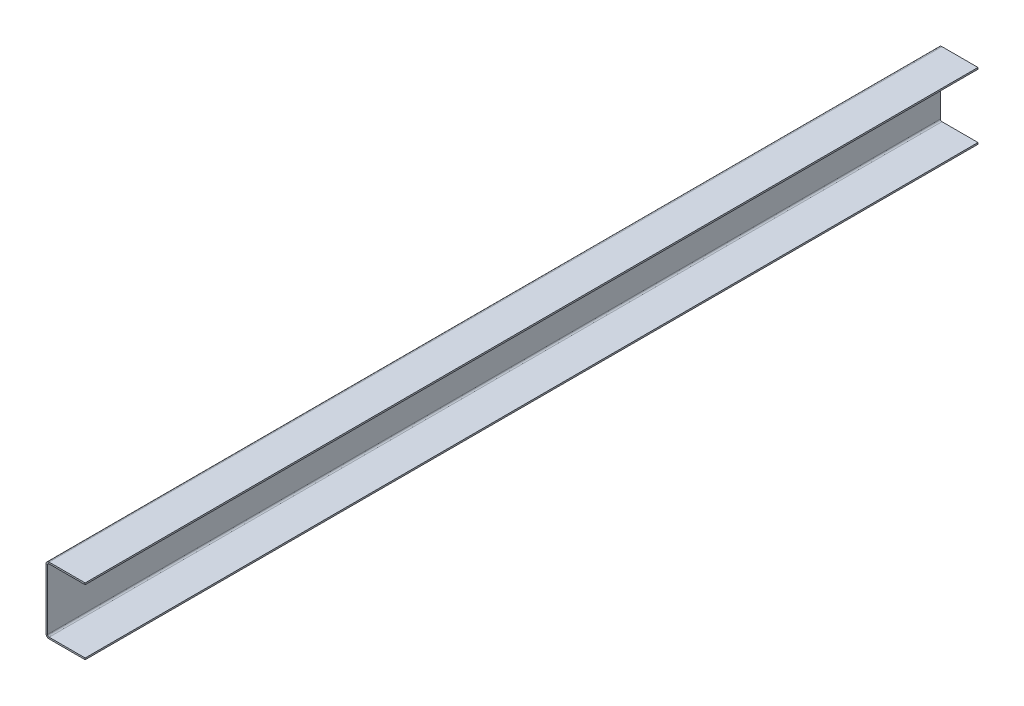
ISO-10303-21;
HEADER;
FILE_DESCRIPTION(('STEP AP214'),'2;1');
FILE_NAME('part.step','',(''),(''),'','','');
FILE_SCHEMA(('AUTOMOTIVE_DESIGN { 1 0 10303 214 1 1 1 1 }'));
ENDSEC;
DATA;
#1=APPLICATION_CONTEXT('core data for automotive mechanical design processes');
#2=APPLICATION_PROTOCOL_DEFINITION('international standard','automotive_design',2000,#1);
#3=PRODUCT_CONTEXT('',#1,'mechanical');
#4=PRODUCT('Part','Part','',(#3));
#5=PRODUCT_RELATED_PRODUCT_CATEGORY('part','',(#4));
#6=PRODUCT_DEFINITION_FORMATION('','',#4);
#7=PRODUCT_DEFINITION_CONTEXT('part definition',#1,'design');
#8=PRODUCT_DEFINITION('design','',#6,#7);
#9=PRODUCT_DEFINITION_SHAPE('','',#8);
#10=(LENGTH_UNIT() NAMED_UNIT(*) SI_UNIT(.MILLI.,.METRE.));
#11=(NAMED_UNIT(*) PLANE_ANGLE_UNIT() SI_UNIT($,.RADIAN.));
#12=(NAMED_UNIT(*) SI_UNIT($,.STERADIAN.) SOLID_ANGLE_UNIT());
#13=UNCERTAINTY_MEASURE_WITH_UNIT(LENGTH_MEASURE(1.E-05),#10,'distance_accuracy_value','');
#14=(GEOMETRIC_REPRESENTATION_CONTEXT(3) GLOBAL_UNCERTAINTY_ASSIGNED_CONTEXT((#13)) GLOBAL_UNIT_ASSIGNED_CONTEXT((#10,
#11,#12)) REPRESENTATION_CONTEXT('',''));
#15=CARTESIAN_POINT('',(0.,0.,0.));
#16=DIRECTION('',(0.,0.,1.));
#17=DIRECTION('',(1.,0.,0.));
#18=AXIS2_PLACEMENT_3D('',#15,#16,#17);
#19=CARTESIAN_POINT('',(4.,85.,1140.));
#20=DIRECTION('',(0.,0.,1.));
#21=DIRECTION('',(1.,0.,0.));
#22=AXIS2_PLACEMENT_3D('',#19,#20,#21);
#23=PLANE('',#22);
#24=DIRECTION('',(0.,-1.,0.));
#25=VECTOR('',#24,1.);
#26=CARTESIAN_POINT('',(4.,85.,1140.));
#27=LINE('',#26,#25);
#28=CARTESIAN_POINT('',(4.,85.,1140.));
#29=VERTEX_POINT('',#28);
#30=CARTESIAN_POINT('',(4.,83.,1140.));
#31=VERTEX_POINT('',#30);
#32=EDGE_CURVE('E11',#29,#31,#27,.T.);
#33=ORIENTED_EDGE('',*,*,#32,.F.);
#34=CARTESIAN_POINT('',(4.,81.,1140.));
#35=DIRECTION('',(0.,0.,-1.));
#36=DIRECTION('',(-1.,0.,0.));
#37=AXIS2_PLACEMENT_3D('',#34,#35,#36);
#38=CIRCLE('',#37,4.);
#39=CARTESIAN_POINT('',(0.,81.,1140.));
#40=VERTEX_POINT('',#39);
#41=EDGE_CURVE('E146',#29,#40,#38,.F.);
#42=ORIENTED_EDGE('',*,*,#41,.T.);
#43=DIRECTION('',(-1.,0.,0.));
#44=VECTOR('',#43,1.);
#45=CARTESIAN_POINT('',(2.,81.,1140.));
#46=LINE('',#45,#44);
#47=CARTESIAN_POINT('',(2.,81.,1140.));
#48=VERTEX_POINT('',#47);
#49=EDGE_CURVE('E44',#48,#40,#46,.T.);
#50=ORIENTED_EDGE('',*,*,#49,.F.);
#51=CARTESIAN_POINT('',(4.,81.,1140.));
#52=DIRECTION('',(0.,0.,1.));
#53=DIRECTION('',(1.,0.,0.));
#54=AXIS2_PLACEMENT_3D('',#51,#52,#53);
#55=CIRCLE('',#54,2.);
#56=EDGE_CURVE('E240',#31,#48,#55,.T.);
#57=ORIENTED_EDGE('',*,*,#56,.F.);
#58=EDGE_LOOP('',(#33,#42,#50,#57));
#59=FACE_BOUND('',#58,.T.);
#60=ADVANCED_FACE('F36',(#59),#23,.T.);
#61=CARTESIAN_POINT('',(2.,81.,1140.));
#62=DIRECTION('',(0.,0.,1.));
#63=DIRECTION('',(1.,0.,0.));
#64=AXIS2_PLACEMENT_3D('',#61,#62,#63);
#65=PLANE('',#64);
#66=DIRECTION('',(-1.,0.,0.));
#67=VECTOR('',#66,1.);
#68=CARTESIAN_POINT('',(50.,85.,1140.));
#69=LINE('',#68,#67);
#70=CARTESIAN_POINT('',(50.,85.,1140.));
#71=VERTEX_POINT('',#70);
#72=EDGE_CURVE('E151',#71,#29,#69,.T.);
#73=ORIENTED_EDGE('',*,*,#72,.T.);
#74=ORIENTED_EDGE('',*,*,#32,.T.);
#75=DIRECTION('',(1.,0.,0.));
#76=VECTOR('',#75,1.);
#77=CARTESIAN_POINT('',(50.,83.,1140.));
#78=LINE('',#77,#76);
#79=CARTESIAN_POINT('',(50.,83.,1140.));
#80=VERTEX_POINT('',#79);
#81=EDGE_CURVE('E253',#80,#31,#78,.F.);
#82=ORIENTED_EDGE('',*,*,#81,.F.);
#83=DIRECTION('',(0.,-1.,0.));
#84=VECTOR('',#83,1.);
#85=CARTESIAN_POINT('',(50.,85.,1140.));
#86=LINE('',#85,#84);
#87=EDGE_CURVE('E255',#71,#80,#86,.T.);
#88=ORIENTED_EDGE('',*,*,#87,.F.);
#89=EDGE_LOOP('',(#73,#74,#82,#88));
#90=FACE_BOUND('',#89,.T.);
#91=ADVANCED_FACE('F266',(#90),#65,.T.);
#92=CARTESIAN_POINT('',(0.,81.,0.));
#93=DIRECTION('',(0.,0.,-1.));
#94=DIRECTION('',(-1.,0.,0.));
#95=AXIS2_PLACEMENT_3D('',#92,#93,#94);
#96=PLANE('',#95);
#97=DIRECTION('',(1.,0.,0.));
#98=VECTOR('',#97,1.);
#99=CARTESIAN_POINT('',(0.,81.,0.));
#100=LINE('',#99,#98);
#101=CARTESIAN_POINT('',(0.,81.,0.));
#102=VERTEX_POINT('',#101);
#103=CARTESIAN_POINT('',(2.,81.,0.));
#104=VERTEX_POINT('',#103);
#105=EDGE_CURVE('E144',#102,#104,#100,.T.);
#106=ORIENTED_EDGE('',*,*,#105,.F.);
#107=CARTESIAN_POINT('',(4.,81.,0.));
#108=DIRECTION('',(0.,0.,-1.));
#109=DIRECTION('',(-1.,0.,0.));
#110=AXIS2_PLACEMENT_3D('',#107,#108,#109);
#111=CIRCLE('',#110,4.);
#112=CARTESIAN_POINT('',(4.,85.,0.));
#113=VERTEX_POINT('',#112);
#114=EDGE_CURVE('E158',#113,#102,#111,.F.);
#115=ORIENTED_EDGE('',*,*,#114,.F.);
#116=DIRECTION('',(0.,1.,0.));
#117=VECTOR('',#116,1.);
#118=CARTESIAN_POINT('',(4.,83.,0.));
#119=LINE('',#118,#117);
#120=CARTESIAN_POINT('',(4.,83.,0.));
#121=VERTEX_POINT('',#120);
#122=EDGE_CURVE('E231',#121,#113,#119,.T.);
#123=ORIENTED_EDGE('',*,*,#122,.F.);
#124=CARTESIAN_POINT('',(4.,81.,0.));
#125=DIRECTION('',(0.,0.,1.));
#126=DIRECTION('',(1.,0.,0.));
#127=AXIS2_PLACEMENT_3D('',#124,#125,#126);
#128=CIRCLE('',#127,2.);
#129=EDGE_CURVE('E185',#121,#104,#128,.T.);
#130=ORIENTED_EDGE('',*,*,#129,.T.);
#131=EDGE_LOOP('',(#106,#115,#123,#130));
#132=FACE_BOUND('',#131,.T.);
#133=ADVANCED_FACE('F245',(#132),#96,.T.);
#134=CARTESIAN_POINT('',(4.,83.,0.));
#135=DIRECTION('',(0.,0.,-1.));
#136=DIRECTION('',(-1.,0.,0.));
#137=AXIS2_PLACEMENT_3D('',#134,#135,#136);
#138=PLANE('',#137);
#139=DIRECTION('',(0.,-1.,0.));
#140=VECTOR('',#139,1.);
#141=CARTESIAN_POINT('',(0.,85.,0.));
#142=LINE('',#141,#140);
#143=CARTESIAN_POINT('',(0.,4.,0.));
#144=VERTEX_POINT('',#143);
#145=EDGE_CURVE('E198',#102,#144,#142,.T.);
#146=ORIENTED_EDGE('',*,*,#145,.F.);
#147=ORIENTED_EDGE('',*,*,#105,.T.);
#148=DIRECTION('',(0.,1.,0.));
#149=VECTOR('',#148,1.);
#150=CARTESIAN_POINT('',(2.,85.,0.));
#151=LINE('',#150,#149);
#152=CARTESIAN_POINT('',(2.,4.,0.));
#153=VERTEX_POINT('',#152);
#154=EDGE_CURVE('E183',#104,#153,#151,.F.);
#155=ORIENTED_EDGE('',*,*,#154,.T.);
#156=DIRECTION('',(-1.,0.,0.));
#157=VECTOR('',#156,1.);
#158=CARTESIAN_POINT('',(2.,4.,0.));
#159=LINE('',#158,#157);
#160=EDGE_CURVE('E93',#153,#144,#159,.T.);
#161=ORIENTED_EDGE('',*,*,#160,.T.);
#162=EDGE_LOOP('',(#146,#147,#155,#161));
#163=FACE_BOUND('',#162,.T.);
#164=ADVANCED_FACE('F233',(#163),#138,.T.);
#165=CARTESIAN_POINT('',(0.,4.,1140.));
#166=DIRECTION('',(0.,0.,1.));
#167=DIRECTION('',(1.,0.,0.));
#168=AXIS2_PLACEMENT_3D('',#165,#166,#167);
#169=PLANE('',#168);
#170=DIRECTION('',(1.,0.,0.));
#171=VECTOR('',#170,1.);
#172=CARTESIAN_POINT('',(0.,4.,1140.));
#173=LINE('',#172,#171);
#174=CARTESIAN_POINT('',(0.,4.,1140.));
#175=VERTEX_POINT('',#174);
#176=CARTESIAN_POINT('',(2.,4.,1140.));
#177=VERTEX_POINT('',#176);
#178=EDGE_CURVE('E229',#175,#177,#173,.T.);
#179=ORIENTED_EDGE('',*,*,#178,.F.);
#180=CARTESIAN_POINT('',(4.,4.,1140.));
#181=DIRECTION('',(0.,0.,-1.));
#182=DIRECTION('',(-1.,0.,0.));
#183=AXIS2_PLACEMENT_3D('',#180,#181,#182);
#184=CIRCLE('',#183,4.);
#185=CARTESIAN_POINT('',(4.,0.,1140.));
#186=VERTEX_POINT('',#185);
#187=EDGE_CURVE('E166',#175,#186,#184,.F.);
#188=ORIENTED_EDGE('',*,*,#187,.T.);
#189=DIRECTION('',(0.,-1.,0.));
#190=VECTOR('',#189,1.);
#191=CARTESIAN_POINT('',(4.,2.,1140.));
#192=LINE('',#191,#190);
#193=CARTESIAN_POINT('',(4.,2.,1140.));
#194=VERTEX_POINT('',#193);
#195=EDGE_CURVE('E52',#194,#186,#192,.T.);
#196=ORIENTED_EDGE('',*,*,#195,.F.);
#197=CARTESIAN_POINT('',(4.,4.,1140.));
#198=DIRECTION('',(0.,0.,1.));
#199=DIRECTION('',(1.,0.,0.));
#200=AXIS2_PLACEMENT_3D('',#197,#198,#199);
#201=CIRCLE('',#200,2.);
#202=EDGE_CURVE('E257',#177,#194,#201,.T.);
#203=ORIENTED_EDGE('',*,*,#202,.F.);
#204=EDGE_LOOP('',(#179,#188,#196,#203));
#205=FACE_BOUND('',#204,.T.);
#206=ADVANCED_FACE('F292',(#205),#169,.T.);
#207=CARTESIAN_POINT('',(4.,2.,1140.));
#208=DIRECTION('',(0.,0.,1.));
#209=DIRECTION('',(1.,0.,0.));
#210=AXIS2_PLACEMENT_3D('',#207,#208,#209);
#211=PLANE('',#210);
#212=DIRECTION('',(0.,-1.,0.));
#213=VECTOR('',#212,1.);
#214=CARTESIAN_POINT('',(0.,85.,1140.));
#215=LINE('',#214,#213);
#216=EDGE_CURVE('E136',#40,#175,#215,.T.);
#217=ORIENTED_EDGE('',*,*,#216,.T.);
#218=ORIENTED_EDGE('',*,*,#178,.T.);
#219=DIRECTION('',(0.,1.,0.));
#220=VECTOR('',#219,1.);
#221=CARTESIAN_POINT('',(2.,85.,1140.));
#222=LINE('',#221,#220);
#223=EDGE_CURVE('E139',#48,#177,#222,.F.);
#224=ORIENTED_EDGE('',*,*,#223,.F.);
#225=ORIENTED_EDGE('',*,*,#49,.T.);
#226=EDGE_LOOP('',(#217,#218,#224,#225));
#227=FACE_BOUND('',#226,.T.);
#228=ADVANCED_FACE('F134',(#227),#211,.T.);
#229=CARTESIAN_POINT('',(4.,0.,0.));
#230=DIRECTION('',(0.,0.,-1.));
#231=DIRECTION('',(-1.,0.,0.));
#232=AXIS2_PLACEMENT_3D('',#229,#230,#231);
#233=PLANE('',#232);
#234=DIRECTION('',(0.,1.,0.));
#235=VECTOR('',#234,1.);
#236=CARTESIAN_POINT('',(4.,0.,0.));
#237=LINE('',#236,#235);
#238=CARTESIAN_POINT('',(4.,0.,0.));
#239=VERTEX_POINT('',#238);
#240=CARTESIAN_POINT('',(4.,2.,0.));
#241=VERTEX_POINT('',#240);
#242=EDGE_CURVE('E100',#239,#241,#237,.T.);
#243=ORIENTED_EDGE('',*,*,#242,.F.);
#244=CARTESIAN_POINT('',(4.,4.,0.));
#245=DIRECTION('',(0.,0.,-1.));
#246=DIRECTION('',(-1.,0.,0.));
#247=AXIS2_PLACEMENT_3D('',#244,#245,#246);
#248=CIRCLE('',#247,4.);
#249=EDGE_CURVE('E200',#144,#239,#248,.F.);
#250=ORIENTED_EDGE('',*,*,#249,.F.);
#251=ORIENTED_EDGE('',*,*,#160,.F.);
#252=CARTESIAN_POINT('',(4.,4.,0.));
#253=DIRECTION('',(0.,0.,1.));
#254=DIRECTION('',(1.,0.,0.));
#255=AXIS2_PLACEMENT_3D('',#252,#253,#254);
#256=CIRCLE('',#255,2.);
#257=EDGE_CURVE('E181',#153,#241,#256,.T.);
#258=ORIENTED_EDGE('',*,*,#257,.T.);
#259=EDGE_LOOP('',(#243,#250,#251,#258));
#260=FACE_BOUND('',#259,.T.);
#261=ADVANCED_FACE('F298',(#260),#233,.T.);
#262=CARTESIAN_POINT('',(2.,4.,0.));
#263=DIRECTION('',(0.,0.,-1.));
#264=DIRECTION('',(-1.,0.,0.));
#265=AXIS2_PLACEMENT_3D('',#262,#263,#264);
#266=PLANE('',#265);
#267=DIRECTION('',(1.,0.,0.));
#268=VECTOR('',#267,1.);
#269=CARTESIAN_POINT('',(0.,0.,0.));
#270=LINE('',#269,#268);
#271=CARTESIAN_POINT('',(50.,0.,0.));
#272=VERTEX_POINT('',#271);
#273=EDGE_CURVE('E172',#239,#272,#270,.T.);
#274=ORIENTED_EDGE('',*,*,#273,.F.);
#275=ORIENTED_EDGE('',*,*,#242,.T.);
#276=DIRECTION('',(1.,0.,0.));
#277=VECTOR('',#276,1.);
#278=CARTESIAN_POINT('',(0.,2.,0.));
#279=LINE('',#278,#277);
#280=CARTESIAN_POINT('',(50.,2.,0.));
#281=VERTEX_POINT('',#280);
#282=EDGE_CURVE('E178',#241,#281,#279,.T.);
#283=ORIENTED_EDGE('',*,*,#282,.T.);
#284=DIRECTION('',(0.,-1.,0.));
#285=VECTOR('',#284,1.);
#286=CARTESIAN_POINT('',(50.,2.,0.));
#287=LINE('',#286,#285);
#288=EDGE_CURVE('E175',#281,#272,#287,.T.);
#289=ORIENTED_EDGE('',*,*,#288,.T.);
#290=EDGE_LOOP('',(#274,#275,#283,#289));
#291=FACE_BOUND('',#290,.T.);
#292=ADVANCED_FACE('F301',(#291),#266,.T.);
#293=CARTESIAN_POINT('',(0.,0.,1140.));
#294=DIRECTION('',(0.,1.,0.));
#295=DIRECTION('',(0.,0.,1.));
#296=AXIS2_PLACEMENT_3D('',#293,#294,#295);
#297=PLANE('',#296);
#298=ORIENTED_EDGE('',*,*,#273,.T.);
#299=DIRECTION('',(0.,0.,-1.));
#300=VECTOR('',#299,1.);
#301=CARTESIAN_POINT('',(50.,0.,1140.));
#302=LINE('',#301,#300);
#303=CARTESIAN_POINT('',(50.,0.,1140.));
#304=VERTEX_POINT('',#303);
#305=EDGE_CURVE('E224',#304,#272,#302,.T.);
#306=ORIENTED_EDGE('',*,*,#305,.F.);
#307=DIRECTION('',(1.,0.,0.));
#308=VECTOR('',#307,1.);
#309=CARTESIAN_POINT('',(0.,0.,1140.));
#310=LINE('',#309,#308);
#311=EDGE_CURVE('E106',#186,#304,#310,.T.);
#312=ORIENTED_EDGE('',*,*,#311,.F.);
#313=DIRECTION('',(0.,0.,-1.));
#314=VECTOR('',#313,1.);
#315=CARTESIAN_POINT('',(4.,0.,1140.));
#316=LINE('',#315,#314);
#317=EDGE_CURVE('E168',#186,#239,#316,.T.);
#318=ORIENTED_EDGE('',*,*,#317,.T.);
#319=EDGE_LOOP('',(#298,#306,#312,#318));
#320=FACE_BOUND('',#319,.T.);
#321=ADVANCED_FACE('F304',(#320),#297,.F.);
#322=CARTESIAN_POINT('',(50.,2.,1140.));
#323=DIRECTION('',(1.,0.,0.));
#324=DIRECTION('',(0.,0.,-1.));
#325=AXIS2_PLACEMENT_3D('',#322,#323,#324);
#326=PLANE('',#325);
#327=ORIENTED_EDGE('',*,*,#288,.F.);
#328=DIRECTION('',(0.,0.,-1.));
#329=VECTOR('',#328,1.);
#330=CARTESIAN_POINT('',(50.,2.,1140.));
#331=LINE('',#330,#329);
#332=CARTESIAN_POINT('',(50.,2.,1140.));
#333=VERTEX_POINT('',#332);
#334=EDGE_CURVE('E222',#333,#281,#331,.T.);
#335=ORIENTED_EDGE('',*,*,#334,.F.);
#336=DIRECTION('',(0.,-1.,0.));
#337=VECTOR('',#336,1.);
#338=CARTESIAN_POINT('',(50.,2.,1140.));
#339=LINE('',#338,#337);
#340=EDGE_CURVE('E512',#333,#304,#339,.T.);
#341=ORIENTED_EDGE('',*,*,#340,.T.);
#342=ORIENTED_EDGE('',*,*,#305,.T.);
#343=EDGE_LOOP('',(#327,#335,#341,#342));
#344=FACE_BOUND('',#343,.T.);
#345=ADVANCED_FACE('F308',(#344),#326,.T.);
#346=CARTESIAN_POINT('',(0.,2.,1140.));
#347=DIRECTION('',(0.,1.,0.));
#348=DIRECTION('',(0.,0.,1.));
#349=AXIS2_PLACEMENT_3D('',#346,#347,#348);
#350=PLANE('',#349);
#351=ORIENTED_EDGE('',*,*,#282,.F.);
#352=DIRECTION('',(0.,0.,-1.));
#353=VECTOR('',#352,1.);
#354=CARTESIAN_POINT('',(4.,2.,1140.));
#355=LINE('',#354,#353);
#356=EDGE_CURVE('E219',#194,#241,#355,.T.);
#357=ORIENTED_EDGE('',*,*,#356,.F.);
#358=DIRECTION('',(1.,0.,0.));
#359=VECTOR('',#358,1.);
#360=CARTESIAN_POINT('',(0.,2.,1140.));
#361=LINE('',#360,#359);
#362=EDGE_CURVE('E514',#194,#333,#361,.T.);
#363=ORIENTED_EDGE('',*,*,#362,.T.);
#364=ORIENTED_EDGE('',*,*,#334,.T.);
#365=EDGE_LOOP('',(#351,#357,#363,#364));
#366=FACE_BOUND('',#365,.T.);
#367=ADVANCED_FACE('F312',(#366),#350,.T.);
#368=CARTESIAN_POINT('',(4.,4.,1140.));
#369=DIRECTION('',(0.,0.,-1.));
#370=DIRECTION('',(-1.,0.,0.));
#371=AXIS2_PLACEMENT_3D('',#368,#369,#370);
#372=CYLINDRICAL_SURFACE('',#371,2.);
#373=ORIENTED_EDGE('',*,*,#257,.F.);
#374=DIRECTION('',(0.,0.,-1.));
#375=VECTOR('',#374,1.);
#376=CARTESIAN_POINT('',(2.,4.,1140.));
#377=LINE('',#376,#375);
#378=EDGE_CURVE('E216',#177,#153,#377,.T.);
#379=ORIENTED_EDGE('',*,*,#378,.F.);
#380=ORIENTED_EDGE('',*,*,#202,.T.);
#381=ORIENTED_EDGE('',*,*,#356,.T.);
#382=EDGE_LOOP('',(#373,#379,#380,#381));
#383=FACE_BOUND('',#382,.T.);
#384=ADVANCED_FACE('F316',(#383),#372,.F.);
#385=CARTESIAN_POINT('',(2.,85.,1140.));
#386=DIRECTION('',(1.,0.,0.));
#387=DIRECTION('',(0.,0.,-1.));
#388=AXIS2_PLACEMENT_3D('',#385,#386,#387);
#389=PLANE('',#388);
#390=ORIENTED_EDGE('',*,*,#154,.F.);
#391=DIRECTION('',(0.,0.,-1.));
#392=VECTOR('',#391,1.);
#393=CARTESIAN_POINT('',(2.,81.,1140.));
#394=LINE('',#393,#392);
#395=EDGE_CURVE('E213',#48,#104,#394,.T.);
#396=ORIENTED_EDGE('',*,*,#395,.F.);
#397=ORIENTED_EDGE('',*,*,#223,.T.);
#398=ORIENTED_EDGE('',*,*,#378,.T.);
#399=EDGE_LOOP('',(#390,#396,#397,#398));
#400=FACE_BOUND('',#399,.T.);
#401=ADVANCED_FACE('F242',(#400),#389,.T.);
#402=CARTESIAN_POINT('',(4.,81.,1140.));
#403=DIRECTION('',(0.,0.,-1.));
#404=DIRECTION('',(-1.,0.,0.));
#405=AXIS2_PLACEMENT_3D('',#402,#403,#404);
#406=CYLINDRICAL_SURFACE('',#405,2.);
#407=ORIENTED_EDGE('',*,*,#129,.F.);
#408=DIRECTION('',(0.,0.,-1.));
#409=VECTOR('',#408,1.);
#410=CARTESIAN_POINT('',(4.,83.,1140.));
#411=LINE('',#410,#409);
#412=EDGE_CURVE('E210',#31,#121,#411,.T.);
#413=ORIENTED_EDGE('',*,*,#412,.F.);
#414=ORIENTED_EDGE('',*,*,#56,.T.);
#415=ORIENTED_EDGE('',*,*,#395,.T.);
#416=EDGE_LOOP('',(#407,#413,#414,#415));
#417=FACE_BOUND('',#416,.T.);
#418=ADVANCED_FACE('F238',(#417),#406,.F.);
#419=CARTESIAN_POINT('',(50.,83.,1140.));
#420=DIRECTION('',(0.,-1.,0.));
#421=DIRECTION('',(0.,0.,-1.));
#422=AXIS2_PLACEMENT_3D('',#419,#420,#421);
#423=PLANE('',#422);
#424=DIRECTION('',(1.,0.,0.));
#425=VECTOR('',#424,1.);
#426=CARTESIAN_POINT('',(50.,83.,0.));
#427=LINE('',#426,#425);
#428=CARTESIAN_POINT('',(50.,83.,0.));
#429=VERTEX_POINT('',#428);
#430=EDGE_CURVE('E188',#429,#121,#427,.F.);
#431=ORIENTED_EDGE('',*,*,#430,.F.);
#432=DIRECTION('',(0.,0.,-1.));
#433=VECTOR('',#432,1.);
#434=CARTESIAN_POINT('',(50.,83.,1140.));
#435=LINE('',#434,#433);
#436=EDGE_CURVE('E208',#80,#429,#435,.T.);
#437=ORIENTED_EDGE('',*,*,#436,.F.);
#438=ORIENTED_EDGE('',*,*,#81,.T.);
#439=ORIENTED_EDGE('',*,*,#412,.T.);
#440=EDGE_LOOP('',(#431,#437,#438,#439));
#441=FACE_BOUND('',#440,.T.);
#442=ADVANCED_FACE('F251',(#441),#423,.T.);
#443=CARTESIAN_POINT('',(50.,85.,1140.));
#444=DIRECTION('',(1.,0.,0.));
#445=DIRECTION('',(0.,0.,-1.));
#446=AXIS2_PLACEMENT_3D('',#443,#444,#445);
#447=PLANE('',#446);
#448=DIRECTION('',(0.,-1.,0.));
#449=VECTOR('',#448,1.);
#450=CARTESIAN_POINT('',(50.,85.,0.));
#451=LINE('',#450,#449);
#452=CARTESIAN_POINT('',(50.,85.,0.));
#453=VERTEX_POINT('',#452);
#454=EDGE_CURVE('E191',#453,#429,#451,.T.);
#455=ORIENTED_EDGE('',*,*,#454,.F.);
#456=DIRECTION('',(0.,0.,-1.));
#457=VECTOR('',#456,1.);
#458=CARTESIAN_POINT('',(50.,85.,1140.));
#459=LINE('',#458,#457);
#460=EDGE_CURVE('E206',#71,#453,#459,.T.);
#461=ORIENTED_EDGE('',*,*,#460,.F.);
#462=ORIENTED_EDGE('',*,*,#87,.T.);
#463=ORIENTED_EDGE('',*,*,#436,.T.);
#464=EDGE_LOOP('',(#455,#461,#462,#463));
#465=FACE_BOUND('',#464,.T.);
#466=ADVANCED_FACE('F272',(#465),#447,.T.);
#467=CARTESIAN_POINT('',(50.,85.,1140.));
#468=DIRECTION('',(0.,-1.,0.));
#469=DIRECTION('',(0.,0.,-1.));
#470=AXIS2_PLACEMENT_3D('',#467,#468,#469);
#471=PLANE('',#470);
#472=DIRECTION('',(-1.,0.,0.));
#473=VECTOR('',#472,1.);
#474=CARTESIAN_POINT('',(50.,85.,0.));
#475=LINE('',#474,#473);
#476=EDGE_CURVE('E194',#453,#113,#475,.T.);
#477=ORIENTED_EDGE('',*,*,#476,.T.);
#478=DIRECTION('',(0.,0.,-1.));
#479=VECTOR('',#478,1.);
#480=CARTESIAN_POINT('',(4.,85.,1140.));
#481=LINE('',#480,#479);
#482=EDGE_CURVE('E160',#29,#113,#481,.T.);
#483=ORIENTED_EDGE('',*,*,#482,.F.);
#484=ORIENTED_EDGE('',*,*,#72,.F.);
#485=ORIENTED_EDGE('',*,*,#460,.T.);
#486=EDGE_LOOP('',(#477,#483,#484,#485));
#487=FACE_BOUND('',#486,.T.);
#488=ADVANCED_FACE('F268',(#487),#471,.F.);
#489=CARTESIAN_POINT('',(4.,81.,1140.));
#490=DIRECTION('',(0.,0.,-1.));
#491=DIRECTION('',(-1.,0.,0.));
#492=AXIS2_PLACEMENT_3D('',#489,#490,#491);
#493=CYLINDRICAL_SURFACE('',#492,4.);
#494=ORIENTED_EDGE('',*,*,#114,.T.);
#495=DIRECTION('',(0.,0.,-1.));
#496=VECTOR('',#495,1.);
#497=CARTESIAN_POINT('',(0.,81.,1140.));
#498=LINE('',#497,#496);
#499=EDGE_CURVE('E155',#40,#102,#498,.T.);
#500=ORIENTED_EDGE('',*,*,#499,.F.);
#501=ORIENTED_EDGE('',*,*,#41,.F.);
#502=ORIENTED_EDGE('',*,*,#482,.T.);
#503=EDGE_LOOP('',(#494,#500,#501,#502));
#504=FACE_BOUND('',#503,.T.);
#505=ADVANCED_FACE('F156',(#504),#493,.T.);
#506=CARTESIAN_POINT('',(0.,85.,1140.));
#507=DIRECTION('',(1.,0.,0.));
#508=DIRECTION('',(0.,0.,-1.));
#509=AXIS2_PLACEMENT_3D('',#506,#507,#508);
#510=PLANE('',#509);
#511=ORIENTED_EDGE('',*,*,#145,.T.);
#512=DIRECTION('',(0.,0.,-1.));
#513=VECTOR('',#512,1.);
#514=CARTESIAN_POINT('',(0.,4.,1140.));
#515=LINE('',#514,#513);
#516=EDGE_CURVE('E161',#175,#144,#515,.T.);
#517=ORIENTED_EDGE('',*,*,#516,.F.);
#518=ORIENTED_EDGE('',*,*,#216,.F.);
#519=ORIENTED_EDGE('',*,*,#499,.T.);
#520=EDGE_LOOP('',(#511,#517,#518,#519));
#521=FACE_BOUND('',#520,.T.);
#522=ADVANCED_FACE('F163',(#521),#510,.F.);
#523=CARTESIAN_POINT('',(4.,4.,1140.));
#524=DIRECTION('',(0.,0.,-1.));
#525=DIRECTION('',(-1.,0.,0.));
#526=AXIS2_PLACEMENT_3D('',#523,#524,#525);
#527=CYLINDRICAL_SURFACE('',#526,4.);
#528=ORIENTED_EDGE('',*,*,#249,.T.);
#529=ORIENTED_EDGE('',*,*,#317,.F.);
#530=ORIENTED_EDGE('',*,*,#187,.F.);
#531=ORIENTED_EDGE('',*,*,#516,.T.);
#532=EDGE_LOOP('',(#528,#529,#530,#531));
#533=FACE_BOUND('',#532,.T.);
#534=ADVANCED_FACE('F363',(#533),#527,.T.);
#535=CARTESIAN_POINT('',(4.,4.,1140.));
#536=DIRECTION('',(0.,0.,1.));
#537=DIRECTION('',(1.,0.,0.));
#538=AXIS2_PLACEMENT_3D('',#535,#536,#537);
#539=PLANE('',#538);
#540=ORIENTED_EDGE('',*,*,#311,.T.);
#541=ORIENTED_EDGE('',*,*,#340,.F.);
#542=ORIENTED_EDGE('',*,*,#362,.F.);
#543=ORIENTED_EDGE('',*,*,#195,.T.);
#544=EDGE_LOOP('',(#540,#541,#542,#543));
#545=FACE_BOUND('',#544,.T.);
#546=ADVANCED_FACE('F373',(#545),#539,.T.);
#547=CARTESIAN_POINT('',(4.,4.,0.));
#548=DIRECTION('',(0.,0.,1.));
#549=DIRECTION('',(1.,0.,0.));
#550=AXIS2_PLACEMENT_3D('',#547,#548,#549);
#551=PLANE('',#550);
#552=ORIENTED_EDGE('',*,*,#430,.T.);
#553=ORIENTED_EDGE('',*,*,#122,.T.);
#554=ORIENTED_EDGE('',*,*,#476,.F.);
#555=ORIENTED_EDGE('',*,*,#454,.T.);
#556=EDGE_LOOP('',(#552,#553,#554,#555));
#557=FACE_BOUND('',#556,.T.);
#558=ADVANCED_FACE('F270',(#557),#551,.F.);
#559=CLOSED_SHELL('',(#60,#91,#133,#164,#206,#228,#261,#292,#321,#345,#367,#384,#401,#418,#442,
#466,#488,#505,#522,#534,#546,#558));
#560=MANIFOLD_SOLID_BREP('B2',#559);
#561=ADVANCED_BREP_SHAPE_REPRESENTATION('',(#18,#560),#14);
#562=SHAPE_DEFINITION_REPRESENTATION(#9,#561);
ENDSEC;
END-ISO-10303-21;
